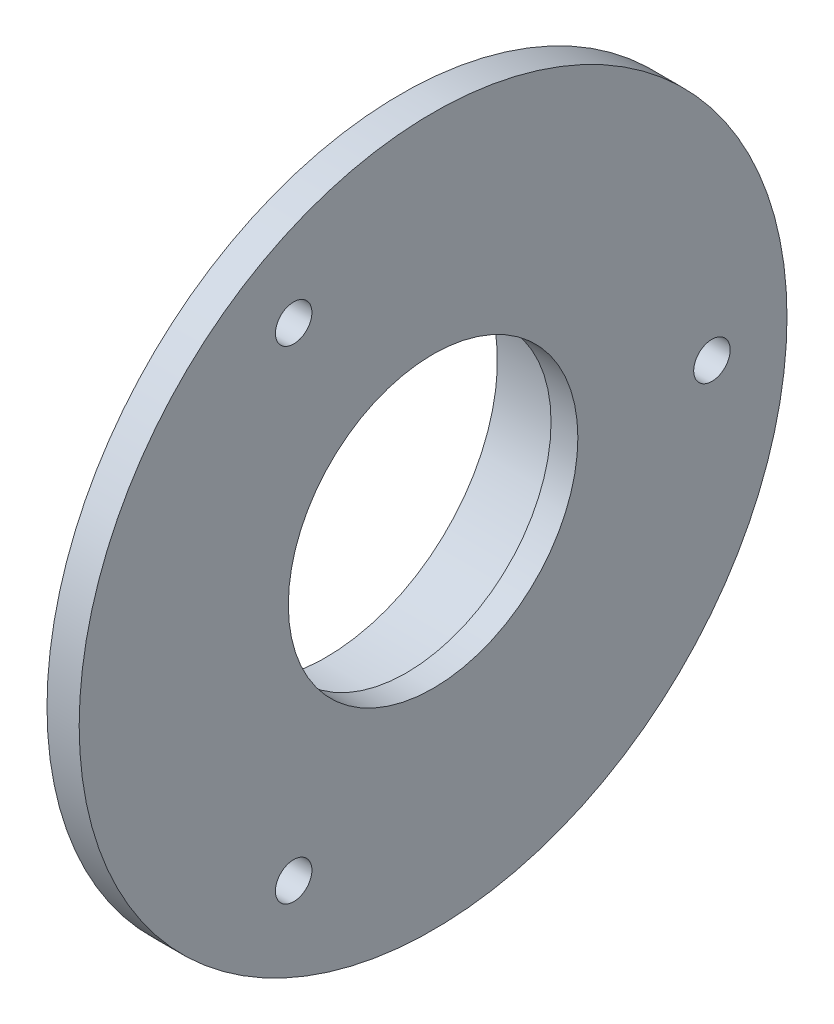
ISO-10303-21;
HEADER;
FILE_DESCRIPTION(('STEP AP214'),'2;1');
FILE_NAME('part.step','',(''),(''),'','','');
FILE_SCHEMA(('AUTOMOTIVE_DESIGN { 1 0 10303 214 1 1 1 1 }'));
ENDSEC;
DATA;
#1=APPLICATION_CONTEXT('core data for automotive mechanical design processes');
#2=APPLICATION_PROTOCOL_DEFINITION('international standard','automotive_design',2000,#1);
#3=PRODUCT_CONTEXT('',#1,'mechanical');
#4=PRODUCT('Part','Part','',(#3));
#5=PRODUCT_RELATED_PRODUCT_CATEGORY('part','',(#4));
#6=PRODUCT_DEFINITION_FORMATION('','',#4);
#7=PRODUCT_DEFINITION_CONTEXT('part definition',#1,'design');
#8=PRODUCT_DEFINITION('design','',#6,#7);
#9=PRODUCT_DEFINITION_SHAPE('','',#8);
#10=(LENGTH_UNIT() NAMED_UNIT(*) SI_UNIT(.MILLI.,.METRE.));
#11=(NAMED_UNIT(*) PLANE_ANGLE_UNIT() SI_UNIT($,.RADIAN.));
#12=(NAMED_UNIT(*) SI_UNIT($,.STERADIAN.) SOLID_ANGLE_UNIT());
#13=UNCERTAINTY_MEASURE_WITH_UNIT(LENGTH_MEASURE(1.E-05),#10,'distance_accuracy_value','');
#14=(GEOMETRIC_REPRESENTATION_CONTEXT(3) GLOBAL_UNCERTAINTY_ASSIGNED_CONTEXT((#13)) GLOBAL_UNIT_ASSIGNED_CONTEXT((#10,
#11,#12)) REPRESENTATION_CONTEXT('',''));
#15=CARTESIAN_POINT('',(0.,0.,0.));
#16=DIRECTION('',(0.,0.,1.));
#17=DIRECTION('',(1.,0.,0.));
#18=AXIS2_PLACEMENT_3D('',#15,#16,#17);
#19=CARTESIAN_POINT('',(-41.,0.,0.));
#20=DIRECTION('',(-1.,0.,0.));
#21=DIRECTION('',(0.,0.,1.));
#22=AXIS2_PLACEMENT_3D('',#19,#20,#21);
#23=CYLINDRICAL_SURFACE('',#22,33.);
#24=CARTESIAN_POINT('',(-41.,0.,0.));
#25=DIRECTION('',(1.,0.,0.));
#26=DIRECTION('',(0.,0.,-1.));
#27=AXIS2_PLACEMENT_3D('',#24,#25,#26);
#28=CIRCLE('',#27,33.);
#29=CARTESIAN_POINT('',(-41.,0.,-33.));
#30=VERTEX_POINT('',#29);
#31=EDGE_CURVE('E46',#30,#30,#28,.T.);
#32=ORIENTED_EDGE('',*,*,#31,.F.);
#33=EDGE_LOOP('',(#32));
#34=FACE_BOUND('',#33,.T.);
#35=CARTESIAN_POINT('',(-44.,0.,0.));
#36=DIRECTION('',(1.,0.,0.));
#37=DIRECTION('',(0.,0.,-1.));
#38=AXIS2_PLACEMENT_3D('',#35,#36,#37);
#39=CIRCLE('',#38,33.);
#40=CARTESIAN_POINT('',(-44.,0.,-33.));
#41=VERTEX_POINT('',#40);
#42=EDGE_CURVE('E51',#41,#41,#39,.T.);
#43=ORIENTED_EDGE('',*,*,#42,.T.);
#44=EDGE_LOOP('',(#43));
#45=FACE_BOUND('',#44,.T.);
#46=ADVANCED_FACE('F39',(#34,#45),#23,.T.);
#47=CARTESIAN_POINT('',(-41.,0.,0.));
#48=DIRECTION('',(1.,0.,0.));
#49=DIRECTION('',(0.,0.,-1.));
#50=AXIS2_PLACEMENT_3D('',#47,#48,#49);
#51=PLANE('',#50);
#52=CARTESIAN_POINT('',(-41.,0.,-26.));
#53=DIRECTION('',(1.,0.,0.));
#54=DIRECTION('',(0.,0.,-1.));
#55=AXIS2_PLACEMENT_3D('',#52,#53,#54);
#56=CIRCLE('',#55,1.7);
#57=CARTESIAN_POINT('',(-41.,0.,-27.7));
#58=VERTEX_POINT('',#57);
#59=EDGE_CURVE('E70',#58,#58,#56,.F.);
#60=ORIENTED_EDGE('',*,*,#59,.T.);
#61=EDGE_LOOP('',(#60));
#62=FACE_BOUND('',#61,.T.);
#63=CARTESIAN_POINT('',(-41.,-22.5166604983954,13.));
#64=DIRECTION('',(1.,0.,0.));
#65=DIRECTION('',(0.,0.,-1.));
#66=AXIS2_PLACEMENT_3D('',#63,#64,#65);
#67=CIRCLE('',#66,1.7);
#68=CARTESIAN_POINT('',(-41.,-22.5166604983954,11.3));
#69=VERTEX_POINT('',#68);
#70=EDGE_CURVE('E67',#69,#69,#67,.F.);
#71=ORIENTED_EDGE('',*,*,#70,.T.);
#72=EDGE_LOOP('',(#71));
#73=FACE_BOUND('',#72,.T.);
#74=CARTESIAN_POINT('',(-41.,22.5166604983954,13.));
#75=DIRECTION('',(1.,0.,0.));
#76=DIRECTION('',(0.,0.,-1.));
#77=AXIS2_PLACEMENT_3D('',#74,#75,#76);
#78=CIRCLE('',#77,1.7);
#79=CARTESIAN_POINT('',(-41.,22.5166604983954,11.3));
#80=VERTEX_POINT('',#79);
#81=EDGE_CURVE('E64',#80,#80,#78,.F.);
#82=ORIENTED_EDGE('',*,*,#81,.T.);
#83=EDGE_LOOP('',(#82));
#84=FACE_BOUND('',#83,.T.);
#85=CARTESIAN_POINT('',(-41.,0.,0.));
#86=DIRECTION('',(1.,0.,0.));
#87=DIRECTION('',(0.,0.,-1.));
#88=AXIS2_PLACEMENT_3D('',#85,#86,#87);
#89=CIRCLE('',#88,13.5);
#90=CARTESIAN_POINT('',(-41.,0.,-13.5));
#91=VERTEX_POINT('',#90);
#92=EDGE_CURVE('E63',#91,#91,#89,.F.);
#93=ORIENTED_EDGE('',*,*,#92,.T.);
#94=EDGE_LOOP('',(#93));
#95=FACE_BOUND('',#94,.T.);
#96=ORIENTED_EDGE('',*,*,#31,.T.);
#97=EDGE_LOOP('',(#96));
#98=FACE_BOUND('',#97,.T.);
#99=ADVANCED_FACE('F97',(#62,#73,#84,#95,#98),#51,.T.);
#100=CARTESIAN_POINT('',(-44.,0.,0.));
#101=DIRECTION('',(1.,0.,0.));
#102=DIRECTION('',(0.,0.,-1.));
#103=AXIS2_PLACEMENT_3D('',#100,#101,#102);
#104=PLANE('',#103);
#105=CARTESIAN_POINT('',(-44.,0.,-26.));
#106=DIRECTION('',(1.,0.,0.));
#107=DIRECTION('',(0.,0.,-1.));
#108=AXIS2_PLACEMENT_3D('',#105,#106,#107);
#109=CIRCLE('',#108,1.7);
#110=CARTESIAN_POINT('',(-44.,0.,-27.7));
#111=VERTEX_POINT('',#110);
#112=EDGE_CURVE('E42',#111,#111,#109,.F.);
#113=ORIENTED_EDGE('',*,*,#112,.F.);
#114=EDGE_LOOP('',(#113));
#115=FACE_BOUND('',#114,.T.);
#116=CARTESIAN_POINT('',(-44.,-22.5166604983954,13.));
#117=DIRECTION('',(1.,0.,0.));
#118=DIRECTION('',(0.,0.,-1.));
#119=AXIS2_PLACEMENT_3D('',#116,#117,#118);
#120=CIRCLE('',#119,1.7);
#121=CARTESIAN_POINT('',(-44.,-22.5166604983954,11.3));
#122=VERTEX_POINT('',#121);
#123=EDGE_CURVE('E68',#122,#122,#120,.F.);
#124=ORIENTED_EDGE('',*,*,#123,.F.);
#125=EDGE_LOOP('',(#124));
#126=FACE_BOUND('',#125,.T.);
#127=CARTESIAN_POINT('',(-44.,22.5166604983954,13.));
#128=DIRECTION('',(1.,0.,0.));
#129=DIRECTION('',(0.,0.,-1.));
#130=AXIS2_PLACEMENT_3D('',#127,#128,#129);
#131=CIRCLE('',#130,1.7);
#132=CARTESIAN_POINT('',(-44.,22.5166604983954,11.3));
#133=VERTEX_POINT('',#132);
#134=EDGE_CURVE('E65',#133,#133,#131,.F.);
#135=ORIENTED_EDGE('',*,*,#134,.F.);
#136=EDGE_LOOP('',(#135));
#137=FACE_BOUND('',#136,.T.);
#138=CARTESIAN_POINT('',(-44.,0.,0.));
#139=DIRECTION('',(1.,0.,0.));
#140=DIRECTION('',(0.,0.,-1.));
#141=AXIS2_PLACEMENT_3D('',#138,#139,#140);
#142=CIRCLE('',#141,22.);
#143=CARTESIAN_POINT('',(-44.,0.,-22.));
#144=VERTEX_POINT('',#143);
#145=EDGE_CURVE('E10',#144,#144,#142,.F.);
#146=ORIENTED_EDGE('',*,*,#145,.F.);
#147=EDGE_LOOP('',(#146));
#148=FACE_BOUND('',#147,.T.);
#149=ORIENTED_EDGE('',*,*,#42,.F.);
#150=EDGE_LOOP('',(#149));
#151=FACE_BOUND('',#150,.T.);
#152=ADVANCED_FACE('F94',(#115,#126,#137,#148,#151),#104,.F.);
#153=CARTESIAN_POINT('',(-43.5,0.,0.));
#154=DIRECTION('',(-1.,0.,0.));
#155=DIRECTION('',(0.,0.,1.));
#156=AXIS2_PLACEMENT_3D('',#153,#154,#155);
#157=CYLINDRICAL_SURFACE('',#156,22.);
#158=CARTESIAN_POINT('',(-51.,0.,0.));
#159=DIRECTION('',(1.,0.,0.));
#160=DIRECTION('',(0.,0.,-1.));
#161=AXIS2_PLACEMENT_3D('',#158,#159,#160);
#162=CIRCLE('',#161,22.);
#163=CARTESIAN_POINT('',(-51.,0.,-22.));
#164=VERTEX_POINT('',#163);
#165=EDGE_CURVE('E58',#164,#164,#162,.T.);
#166=ORIENTED_EDGE('',*,*,#165,.T.);
#167=EDGE_LOOP('',(#166));
#168=FACE_BOUND('',#167,.T.);
#169=ORIENTED_EDGE('',*,*,#145,.T.);
#170=EDGE_LOOP('',(#169));
#171=FACE_BOUND('',#170,.T.);
#172=ADVANCED_FACE('F96',(#168,#171),#157,.T.);
#173=CARTESIAN_POINT('',(-51.,0.,0.));
#174=DIRECTION('',(1.,0.,0.));
#175=DIRECTION('',(0.,0.,-1.));
#176=AXIS2_PLACEMENT_3D('',#173,#174,#175);
#177=PLANE('',#176);
#178=CARTESIAN_POINT('',(-51.,0.,0.));
#179=DIRECTION('',(1.,0.,0.));
#180=DIRECTION('',(0.,0.,-1.));
#181=AXIS2_PLACEMENT_3D('',#178,#179,#180);
#182=CIRCLE('',#181,16.);
#183=CARTESIAN_POINT('',(-51.,0.,16.));
#184=VERTEX_POINT('',#183);
#185=EDGE_CURVE('E55',#184,#184,#182,.F.);
#186=ORIENTED_EDGE('',*,*,#185,.F.);
#187=EDGE_LOOP('',(#186));
#188=FACE_BOUND('',#187,.T.);
#189=ORIENTED_EDGE('',*,*,#165,.F.);
#190=EDGE_LOOP('',(#189));
#191=FACE_BOUND('',#190,.T.);
#192=ADVANCED_FACE('F103',(#188,#191),#177,.F.);
#193=CARTESIAN_POINT('',(-43.5,0.,0.));
#194=DIRECTION('',(-1.,0.,0.));
#195=DIRECTION('',(0.,0.,1.));
#196=AXIS2_PLACEMENT_3D('',#193,#194,#195);
#197=CYLINDRICAL_SURFACE('',#196,16.);
#198=CARTESIAN_POINT('',(-43.5,0.,0.));
#199=DIRECTION('',(1.,0.,0.));
#200=DIRECTION('',(0.,0.,-1.));
#201=AXIS2_PLACEMENT_3D('',#198,#199,#200);
#202=CIRCLE('',#201,16.);
#203=CARTESIAN_POINT('',(-43.5,0.,16.));
#204=VERTEX_POINT('',#203);
#205=EDGE_CURVE('E59',#204,#204,#202,.T.);
#206=CARTESIAN_POINT('',(-43.5,0.,16.));
#207=CARTESIAN_POINT('',(-43.578125,0.,16.));
#208=CARTESIAN_POINT('',(-43.65625,0.,16.));
#209=CARTESIAN_POINT('',(-43.8125,0.,16.));
#210=CARTESIAN_POINT('',(-43.890625,0.,16.));
#211=CARTESIAN_POINT('',(-44.046875,0.,16.));
#212=CARTESIAN_POINT('',(-44.125,0.,16.));
#213=CARTESIAN_POINT('',(-44.28125,0.,16.));
#214=CARTESIAN_POINT('',(-44.359375,0.,16.));
#215=CARTESIAN_POINT('',(-44.515625,0.,16.));
#216=CARTESIAN_POINT('',(-44.59375,0.,16.));
#217=CARTESIAN_POINT('',(-44.75,0.,16.));
#218=CARTESIAN_POINT('',(-44.828125,0.,16.));
#219=CARTESIAN_POINT('',(-44.984375,0.,16.));
#220=CARTESIAN_POINT('',(-45.0625,0.,16.));
#221=CARTESIAN_POINT('',(-45.21875,0.,16.));
#222=CARTESIAN_POINT('',(-45.296875,0.,16.));
#223=CARTESIAN_POINT('',(-45.453125,0.,16.));
#224=CARTESIAN_POINT('',(-45.53125,0.,16.));
#225=CARTESIAN_POINT('',(-45.6875,0.,16.));
#226=CARTESIAN_POINT('',(-45.765625,0.,16.));
#227=CARTESIAN_POINT('',(-45.921875,0.,16.));
#228=CARTESIAN_POINT('',(-46.,0.,16.));
#229=CARTESIAN_POINT('',(-46.15625,0.,16.));
#230=CARTESIAN_POINT('',(-46.234375,0.,16.));
#231=CARTESIAN_POINT('',(-46.390625,0.,16.));
#232=CARTESIAN_POINT('',(-46.46875,0.,16.));
#233=CARTESIAN_POINT('',(-46.625,0.,16.));
#234=CARTESIAN_POINT('',(-46.703125,0.,16.));
#235=CARTESIAN_POINT('',(-46.859375,0.,16.));
#236=CARTESIAN_POINT('',(-46.9375,0.,16.));
#237=CARTESIAN_POINT('',(-47.09375,0.,16.));
#238=CARTESIAN_POINT('',(-47.171875,0.,16.));
#239=CARTESIAN_POINT('',(-47.328125,0.,16.));
#240=CARTESIAN_POINT('',(-47.40625,0.,16.));
#241=CARTESIAN_POINT('',(-47.5625,0.,16.));
#242=CARTESIAN_POINT('',(-47.640625,0.,16.));
#243=CARTESIAN_POINT('',(-47.796875,0.,16.));
#244=CARTESIAN_POINT('',(-47.875,0.,16.));
#245=CARTESIAN_POINT('',(-48.03125,0.,16.));
#246=CARTESIAN_POINT('',(-48.109375,0.,16.));
#247=CARTESIAN_POINT('',(-48.265625,0.,16.));
#248=CARTESIAN_POINT('',(-48.34375,0.,16.));
#249=CARTESIAN_POINT('',(-48.5,0.,16.));
#250=CARTESIAN_POINT('',(-48.578125,0.,16.));
#251=CARTESIAN_POINT('',(-48.734375,0.,16.));
#252=CARTESIAN_POINT('',(-48.8125,0.,16.));
#253=CARTESIAN_POINT('',(-48.96875,0.,16.));
#254=CARTESIAN_POINT('',(-49.046875,0.,16.));
#255=CARTESIAN_POINT('',(-49.203125,0.,16.));
#256=CARTESIAN_POINT('',(-49.28125,0.,16.));
#257=CARTESIAN_POINT('',(-49.4375,0.,16.));
#258=CARTESIAN_POINT('',(-49.515625,0.,16.));
#259=CARTESIAN_POINT('',(-49.671875,0.,16.));
#260=CARTESIAN_POINT('',(-49.75,0.,16.));
#261=CARTESIAN_POINT('',(-49.90625,0.,16.));
#262=CARTESIAN_POINT('',(-49.984375,0.,16.));
#263=CARTESIAN_POINT('',(-50.140625,0.,16.));
#264=CARTESIAN_POINT('',(-50.21875,0.,16.));
#265=CARTESIAN_POINT('',(-50.375,0.,16.));
#266=CARTESIAN_POINT('',(-50.453125,0.,16.));
#267=CARTESIAN_POINT('',(-50.609375,0.,16.));
#268=CARTESIAN_POINT('',(-50.6875,0.,16.));
#269=CARTESIAN_POINT('',(-50.84375,0.,16.));
#270=CARTESIAN_POINT('',(-50.921875,0.,16.));
#271=CARTESIAN_POINT('',(-51.,0.,16.));
#272=B_SPLINE_CURVE_WITH_KNOTS('',3,(#206,#207,#208,#209,#210,#211,#212,#213,#214,#215,#216,
#217,#218,#219,#220,#221,#222,#223,#224,#225,#226,#227,#228,#229,#230,#231,#232,#233,#234,#235,
#236,#237,#238,#239,#240,#241,#242,#243,#244,#245,#246,#247,#248,#249,#250,#251,#252,#253,#254,
#255,#256,#257,#258,#259,#260,#261,#262,#263,#264,#265,#266,#267,#268,#269,#270,#271),
.UNSPECIFIED.,.F.,.F.,(4,2,2,2,2,2,2,2,2,2,2,2,2,2,2,2,2,2,2,2,2,2,2,2,2,2,2,2,2,2,2,2,4),(0.,
0.234374999999995,0.468749999999997,0.703124999999999,0.937500000000001,1.171875,1.40625,
1.640625,1.875,2.109375,2.34375,2.578125,2.8125,3.046875,3.28125,3.515625,3.75,3.98437500000001,
4.21875000000001,4.453125,4.6875,4.92187500000001,5.15625000000001,5.39062500000001,
5.62500000000001,5.85937500000001,6.09375000000001,6.32812500000001,6.56250000000001,
6.79687500000001,7.03125000000001,7.26562500000001,7.50000000000001),.UNSPECIFIED.);
#273=EDGE_CURVE('BSEAM171',#204,#184,#272,.T.);
#274=ORIENTED_EDGE('',*,*,#205,.T.);
#275=ORIENTED_EDGE('',*,*,#185,.T.);
#276=ORIENTED_EDGE('',*,*,#273,.T.);
#277=ORIENTED_EDGE('',*,*,#273,.F.);
#278=EDGE_LOOP('',(#274,#276,#275,#277));
#279=FACE_BOUND('',#278,.T.);
#280=ADVANCED_FACE('F171',(#279),#197,.F.);
#281=CARTESIAN_POINT('',(-43.5,0.,0.));
#282=DIRECTION('',(1.,0.,0.));
#283=DIRECTION('',(0.,0.,-1.));
#284=AXIS2_PLACEMENT_3D('',#281,#282,#283);
#285=PLANE('',#284);
#286=CARTESIAN_POINT('',(-43.5,0.,0.));
#287=DIRECTION('',(1.,0.,0.));
#288=DIRECTION('',(0.,0.,-1.));
#289=AXIS2_PLACEMENT_3D('',#286,#287,#288);
#290=CIRCLE('',#289,13.5);
#291=CARTESIAN_POINT('',(-43.5,0.,-13.5));
#292=VERTEX_POINT('',#291);
#293=EDGE_CURVE('E60',#292,#292,#290,.F.);
#294=ORIENTED_EDGE('',*,*,#293,.F.);
#295=EDGE_LOOP('',(#294));
#296=FACE_BOUND('',#295,.T.);
#297=ORIENTED_EDGE('',*,*,#205,.F.);
#298=EDGE_LOOP('',(#297));
#299=FACE_BOUND('',#298,.T.);
#300=ADVANCED_FACE('F162',(#296,#299),#285,.F.);
#301=CARTESIAN_POINT('',(-40.9,0.,0.));
#302=DIRECTION('',(-1.,0.,0.));
#303=DIRECTION('',(0.,0.,1.));
#304=AXIS2_PLACEMENT_3D('',#301,#302,#303);
#305=CYLINDRICAL_SURFACE('',#304,13.5);
#306=ORIENTED_EDGE('',*,*,#92,.F.);
#307=EDGE_LOOP('',(#306));
#308=FACE_BOUND('',#307,.T.);
#309=ORIENTED_EDGE('',*,*,#293,.T.);
#310=EDGE_LOOP('',(#309));
#311=FACE_BOUND('',#310,.T.);
#312=ADVANCED_FACE('F153',(#308,#311),#305,.F.);
#313=CARTESIAN_POINT('',(-40.9,22.5166604983954,13.));
#314=DIRECTION('',(-1.,0.,0.));
#315=DIRECTION('',(0.,0.,1.));
#316=AXIS2_PLACEMENT_3D('',#313,#314,#315);
#317=CYLINDRICAL_SURFACE('',#316,1.7);
#318=ORIENTED_EDGE('',*,*,#81,.F.);
#319=EDGE_LOOP('',(#318));
#320=FACE_BOUND('',#319,.T.);
#321=ORIENTED_EDGE('',*,*,#134,.T.);
#322=EDGE_LOOP('',(#321));
#323=FACE_BOUND('',#322,.T.);
#324=ADVANCED_FACE('F143',(#320,#323),#317,.F.);
#325=CARTESIAN_POINT('',(-40.9,-22.5166604983954,13.));
#326=DIRECTION('',(-1.,0.,0.));
#327=DIRECTION('',(0.,0.,1.));
#328=AXIS2_PLACEMENT_3D('',#325,#326,#327);
#329=CYLINDRICAL_SURFACE('',#328,1.7);
#330=ORIENTED_EDGE('',*,*,#70,.F.);
#331=EDGE_LOOP('',(#330));
#332=FACE_BOUND('',#331,.T.);
#333=ORIENTED_EDGE('',*,*,#123,.T.);
#334=EDGE_LOOP('',(#333));
#335=FACE_BOUND('',#334,.T.);
#336=ADVANCED_FACE('F126',(#332,#335),#329,.F.);
#337=CARTESIAN_POINT('',(-40.9,0.,-26.));
#338=DIRECTION('',(-1.,0.,0.));
#339=DIRECTION('',(0.,0.,1.));
#340=AXIS2_PLACEMENT_3D('',#337,#338,#339);
#341=CYLINDRICAL_SURFACE('',#340,1.7);
#342=ORIENTED_EDGE('',*,*,#59,.F.);
#343=EDGE_LOOP('',(#342));
#344=FACE_BOUND('',#343,.T.);
#345=ORIENTED_EDGE('',*,*,#112,.T.);
#346=EDGE_LOOP('',(#345));
#347=FACE_BOUND('',#346,.T.);
#348=ADVANCED_FACE('F132',(#344,#347),#341,.F.);
#349=CLOSED_SHELL('',(#46,#99,#152,#172,#192,#280,#300,#312,#324,#336,#348));
#350=MANIFOLD_SOLID_BREP('B2',#349);
#351=ADVANCED_BREP_SHAPE_REPRESENTATION('',(#18,#350),#14);
#352=SHAPE_DEFINITION_REPRESENTATION(#9,#351);
ENDSEC;
END-ISO-10303-21;
